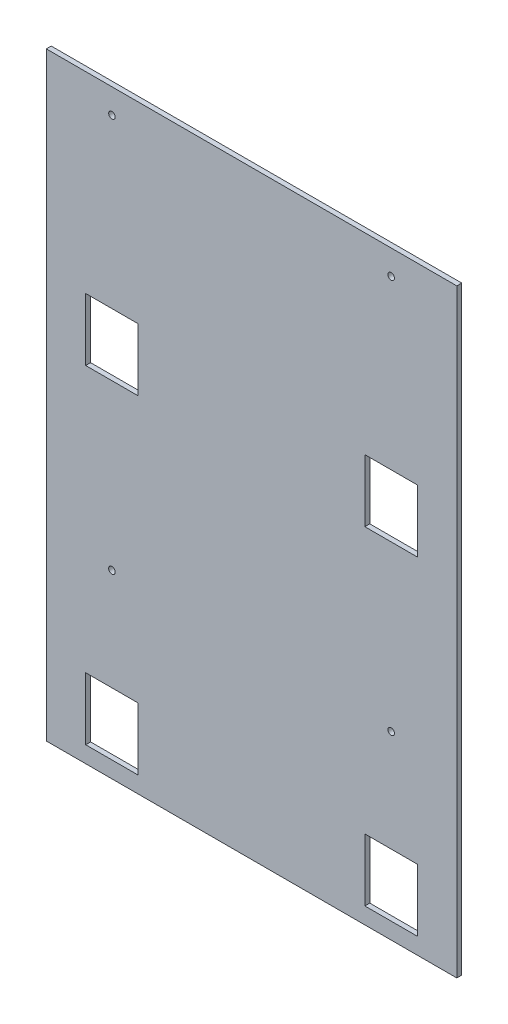
ISO-10303-21;
HEADER;
FILE_DESCRIPTION(('STEP AP214'),'2;1');
FILE_NAME('part.step','',(''),(''),'','','');
FILE_SCHEMA(('AUTOMOTIVE_DESIGN { 1 0 10303 214 1 1 1 1 }'));
ENDSEC;
DATA;
#1=APPLICATION_CONTEXT('core data for automotive mechanical design processes');
#2=APPLICATION_PROTOCOL_DEFINITION('international standard','automotive_design',2000,#1);
#3=PRODUCT_CONTEXT('',#1,'mechanical');
#4=PRODUCT('Part','Part','',(#3));
#5=PRODUCT_RELATED_PRODUCT_CATEGORY('part','',(#4));
#6=PRODUCT_DEFINITION_FORMATION('','',#4);
#7=PRODUCT_DEFINITION_CONTEXT('part definition',#1,'design');
#8=PRODUCT_DEFINITION('design','',#6,#7);
#9=PRODUCT_DEFINITION_SHAPE('','',#8);
#10=(LENGTH_UNIT() NAMED_UNIT(*) SI_UNIT(.MILLI.,.METRE.));
#11=(NAMED_UNIT(*) PLANE_ANGLE_UNIT() SI_UNIT($,.RADIAN.));
#12=(NAMED_UNIT(*) SI_UNIT($,.STERADIAN.) SOLID_ANGLE_UNIT());
#13=UNCERTAINTY_MEASURE_WITH_UNIT(LENGTH_MEASURE(1.E-05),#10,'distance_accuracy_value','');
#14=(GEOMETRIC_REPRESENTATION_CONTEXT(3) GLOBAL_UNCERTAINTY_ASSIGNED_CONTEXT((#13)) GLOBAL_UNIT_ASSIGNED_CONTEXT((#10,
#11,#12)) REPRESENTATION_CONTEXT('',''));
#15=CARTESIAN_POINT('',(0.,0.,0.));
#16=DIRECTION('',(0.,0.,1.));
#17=DIRECTION('',(1.,0.,0.));
#18=AXIS2_PLACEMENT_3D('',#15,#16,#17);
#19=CARTESIAN_POINT('',(-125.,-182.5,3.));
#20=DIRECTION('',(1.,0.,0.));
#21=DIRECTION('',(0.,0.,-1.));
#22=AXIS2_PLACEMENT_3D('',#19,#20,#21);
#23=PLANE('',#22);
#24=DIRECTION('',(0.,-1.,0.));
#25=VECTOR('',#24,1.);
#26=CARTESIAN_POINT('',(-125.,-182.5,0.));
#27=LINE('',#26,#25);
#28=CARTESIAN_POINT('',(-125.,182.5,0.));
#29=VERTEX_POINT('',#28);
#30=CARTESIAN_POINT('',(-125.,-182.5,0.));
#31=VERTEX_POINT('',#30);
#32=EDGE_CURVE('E315',#29,#31,#27,.T.);
#33=ORIENTED_EDGE('',*,*,#32,.T.);
#34=DIRECTION('',(0.,0.,-1.));
#35=VECTOR('',#34,1.);
#36=CARTESIAN_POINT('',(-125.,-182.5,3.));
#37=LINE('',#36,#35);
#38=CARTESIAN_POINT('',(-125.,-182.5,3.));
#39=VERTEX_POINT('',#38);
#40=EDGE_CURVE('E11',#39,#31,#37,.T.);
#41=ORIENTED_EDGE('',*,*,#40,.F.);
#42=DIRECTION('',(0.,-1.,0.));
#43=VECTOR('',#42,1.);
#44=CARTESIAN_POINT('',(-125.,-182.5,3.));
#45=LINE('',#44,#43);
#46=CARTESIAN_POINT('',(-125.,182.5,3.));
#47=VERTEX_POINT('',#46);
#48=EDGE_CURVE('E318',#47,#39,#45,.T.);
#49=ORIENTED_EDGE('',*,*,#48,.F.);
#50=DIRECTION('',(0.,0.,-1.));
#51=VECTOR('',#50,1.);
#52=CARTESIAN_POINT('',(-125.,182.5,3.));
#53=LINE('',#52,#51);
#54=EDGE_CURVE('E328',#47,#29,#53,.T.);
#55=ORIENTED_EDGE('',*,*,#54,.T.);
#56=EDGE_LOOP('',(#33,#41,#49,#55));
#57=FACE_BOUND('',#56,.T.);
#58=ADVANCED_FACE('F34',(#57),#23,.F.);
#59=CARTESIAN_POINT('',(125.,-182.5,3.));
#60=DIRECTION('',(0.,1.,0.));
#61=DIRECTION('',(-1.,0.,0.));
#62=AXIS2_PLACEMENT_3D('',#59,#60,#61);
#63=PLANE('',#62);
#64=DIRECTION('',(1.,0.,0.));
#65=VECTOR('',#64,1.);
#66=CARTESIAN_POINT('',(125.,-182.5,0.));
#67=LINE('',#66,#65);
#68=CARTESIAN_POINT('',(125.,-182.5,0.));
#69=VERTEX_POINT('',#68);
#70=EDGE_CURVE('E331',#31,#69,#67,.T.);
#71=ORIENTED_EDGE('',*,*,#70,.T.);
#72=DIRECTION('',(0.,0.,-1.));
#73=VECTOR('',#72,1.);
#74=CARTESIAN_POINT('',(125.,-182.5,3.));
#75=LINE('',#74,#73);
#76=CARTESIAN_POINT('',(125.,-182.5,3.));
#77=VERTEX_POINT('',#76);
#78=EDGE_CURVE('E41',#77,#69,#75,.T.);
#79=ORIENTED_EDGE('',*,*,#78,.F.);
#80=DIRECTION('',(1.,0.,0.));
#81=VECTOR('',#80,1.);
#82=CARTESIAN_POINT('',(125.,-182.5,3.));
#83=LINE('',#82,#81);
#84=EDGE_CURVE('E321',#39,#77,#83,.T.);
#85=ORIENTED_EDGE('',*,*,#84,.F.);
#86=ORIENTED_EDGE('',*,*,#40,.T.);
#87=EDGE_LOOP('',(#71,#79,#85,#86));
#88=FACE_BOUND('',#87,.T.);
#89=ADVANCED_FACE('F360',(#88),#63,.F.);
#90=CARTESIAN_POINT('',(125.,-182.5,3.));
#91=DIRECTION('',(-1.,0.,0.));
#92=DIRECTION('',(0.,0.,1.));
#93=AXIS2_PLACEMENT_3D('',#90,#91,#92);
#94=PLANE('',#93);
#95=DIRECTION('',(0.,1.,0.));
#96=VECTOR('',#95,1.);
#97=CARTESIAN_POINT('',(125.,-182.5,0.));
#98=LINE('',#97,#96);
#99=CARTESIAN_POINT('',(125.,182.5,0.));
#100=VERTEX_POINT('',#99);
#101=EDGE_CURVE('E333',#69,#100,#98,.T.);
#102=ORIENTED_EDGE('',*,*,#101,.T.);
#103=DIRECTION('',(0.,0.,-1.));
#104=VECTOR('',#103,1.);
#105=CARTESIAN_POINT('',(125.,182.5,3.));
#106=LINE('',#105,#104);
#107=CARTESIAN_POINT('',(125.,182.5,3.));
#108=VERTEX_POINT('',#107);
#109=EDGE_CURVE('E338',#108,#100,#106,.T.);
#110=ORIENTED_EDGE('',*,*,#109,.F.);
#111=DIRECTION('',(0.,1.,0.));
#112=VECTOR('',#111,1.);
#113=CARTESIAN_POINT('',(125.,-182.5,3.));
#114=LINE('',#113,#112);
#115=EDGE_CURVE('E324',#77,#108,#114,.T.);
#116=ORIENTED_EDGE('',*,*,#115,.F.);
#117=ORIENTED_EDGE('',*,*,#78,.T.);
#118=EDGE_LOOP('',(#102,#110,#116,#117));
#119=FACE_BOUND('',#118,.T.);
#120=ADVANCED_FACE('F345',(#119),#94,.F.);
#121=CARTESIAN_POINT('',(125.,182.5,3.));
#122=DIRECTION('',(0.,-1.,0.));
#123=DIRECTION('',(1.,0.,0.));
#124=AXIS2_PLACEMENT_3D('',#121,#122,#123);
#125=PLANE('',#124);
#126=DIRECTION('',(-1.,0.,0.));
#127=VECTOR('',#126,1.);
#128=CARTESIAN_POINT('',(125.,182.5,0.));
#129=LINE('',#128,#127);
#130=EDGE_CURVE('E322',#100,#29,#129,.T.);
#131=ORIENTED_EDGE('',*,*,#130,.T.);
#132=ORIENTED_EDGE('',*,*,#54,.F.);
#133=DIRECTION('',(-1.,0.,0.));
#134=VECTOR('',#133,1.);
#135=CARTESIAN_POINT('',(125.,182.5,3.));
#136=LINE('',#135,#134);
#137=EDGE_CURVE('E326',#108,#47,#136,.T.);
#138=ORIENTED_EDGE('',*,*,#137,.F.);
#139=ORIENTED_EDGE('',*,*,#109,.T.);
#140=EDGE_LOOP('',(#131,#132,#138,#139));
#141=FACE_BOUND('',#140,.T.);
#142=ADVANCED_FACE('F353',(#141),#125,.F.);
#143=CARTESIAN_POINT('',(0.,0.,3.));
#144=DIRECTION('',(0.,0.,1.));
#145=DIRECTION('',(1.,0.,0.));
#146=AXIS2_PLACEMENT_3D('',#143,#144,#145);
#147=PLANE('',#146);
#148=DIRECTION('',(-1.,0.,0.));
#149=VECTOR('',#148,1.);
#150=CARTESIAN_POINT('',(0.,-134.500000000001,3.));
#151=LINE('',#150,#149);
#152=CARTESIAN_POINT('',(-68.9999999999973,-134.500000000001,3.));
#153=VERTEX_POINT('',#152);
#154=CARTESIAN_POINT('',(-100.999999999997,-134.500000000001,3.));
#155=VERTEX_POINT('',#154);
#156=EDGE_CURVE('E291',#153,#155,#151,.T.);
#157=ORIENTED_EDGE('',*,*,#156,.F.);
#158=DIRECTION('',(0.,1.,0.));
#159=VECTOR('',#158,1.);
#160=CARTESIAN_POINT('',(-68.9999999999973,0.,3.));
#161=LINE('',#160,#159);
#162=CARTESIAN_POINT('',(-68.9999999999973,-172.500000000001,3.));
#163=VERTEX_POINT('',#162);
#164=EDGE_CURVE('E285',#163,#153,#161,.T.);
#165=ORIENTED_EDGE('',*,*,#164,.F.);
#166=DIRECTION('',(1.,0.,0.));
#167=VECTOR('',#166,1.);
#168=CARTESIAN_POINT('',(0.,-172.500000000001,3.));
#169=LINE('',#168,#167);
#170=CARTESIAN_POINT('',(-100.999999999997,-172.500000000001,3.));
#171=VERTEX_POINT('',#170);
#172=EDGE_CURVE('E287',#171,#163,#169,.T.);
#173=ORIENTED_EDGE('',*,*,#172,.F.);
#174=DIRECTION('',(0.,-1.,0.));
#175=VECTOR('',#174,1.);
#176=CARTESIAN_POINT('',(-100.999999999997,0.,3.));
#177=LINE('',#176,#175);
#178=EDGE_CURVE('E289',#155,#171,#177,.T.);
#179=ORIENTED_EDGE('',*,*,#178,.F.);
#180=EDGE_LOOP('',(#157,#165,#173,#179));
#181=FACE_BOUND('',#180,.T.);
#182=DIRECTION('',(0.,1.,0.));
#183=VECTOR('',#182,1.);
#184=CARTESIAN_POINT('',(100.999999999997,0.,3.));
#185=LINE('',#184,#183);
#186=CARTESIAN_POINT('',(100.999999999997,27.4999999999986,3.));
#187=VERTEX_POINT('',#186);
#188=CARTESIAN_POINT('',(100.999999999997,65.4999999999986,3.));
#189=VERTEX_POINT('',#188);
#190=EDGE_CURVE('E283',#187,#189,#185,.T.);
#191=ORIENTED_EDGE('',*,*,#190,.F.);
#192=DIRECTION('',(1.,0.,0.));
#193=VECTOR('',#192,1.);
#194=CARTESIAN_POINT('',(0.,27.4999999999986,3.));
#195=LINE('',#194,#193);
#196=CARTESIAN_POINT('',(68.9999999999973,27.4999999999986,3.));
#197=VERTEX_POINT('',#196);
#198=EDGE_CURVE('E277',#197,#187,#195,.T.);
#199=ORIENTED_EDGE('',*,*,#198,.F.);
#200=DIRECTION('',(0.,-1.,0.));
#201=VECTOR('',#200,1.);
#202=CARTESIAN_POINT('',(68.9999999999973,0.,3.));
#203=LINE('',#202,#201);
#204=CARTESIAN_POINT('',(68.9999999999973,65.4999999999986,3.));
#205=VERTEX_POINT('',#204);
#206=EDGE_CURVE('E279',#205,#197,#203,.T.);
#207=ORIENTED_EDGE('',*,*,#206,.F.);
#208=DIRECTION('',(-1.,0.,0.));
#209=VECTOR('',#208,1.);
#210=CARTESIAN_POINT('',(0.,65.4999999999986,3.));
#211=LINE('',#210,#209);
#212=EDGE_CURVE('E281',#189,#205,#211,.T.);
#213=ORIENTED_EDGE('',*,*,#212,.F.);
#214=EDGE_LOOP('',(#191,#199,#207,#213));
#215=FACE_BOUND('',#214,.T.);
#216=DIRECTION('',(-1.,0.,0.));
#217=VECTOR('',#216,1.);
#218=CARTESIAN_POINT('',(0.,65.4999999999986,3.));
#219=LINE('',#218,#217);
#220=CARTESIAN_POINT('',(-68.9999999999973,65.4999999999986,3.));
#221=VERTEX_POINT('',#220);
#222=CARTESIAN_POINT('',(-100.999999999997,65.4999999999986,3.));
#223=VERTEX_POINT('',#222);
#224=EDGE_CURVE('E275',#221,#223,#219,.T.);
#225=ORIENTED_EDGE('',*,*,#224,.F.);
#226=DIRECTION('',(0.,1.,0.));
#227=VECTOR('',#226,1.);
#228=CARTESIAN_POINT('',(-68.9999999999973,0.,3.));
#229=LINE('',#228,#227);
#230=CARTESIAN_POINT('',(-68.9999999999973,27.4999999999986,3.));
#231=VERTEX_POINT('',#230);
#232=EDGE_CURVE('E270',#231,#221,#229,.T.);
#233=ORIENTED_EDGE('',*,*,#232,.F.);
#234=DIRECTION('',(1.,0.,0.));
#235=VECTOR('',#234,1.);
#236=CARTESIAN_POINT('',(0.,27.4999999999986,3.));
#237=LINE('',#236,#235);
#238=CARTESIAN_POINT('',(-100.999999999997,27.4999999999986,3.));
#239=VERTEX_POINT('',#238);
#240=EDGE_CURVE('E178',#239,#231,#237,.T.);
#241=ORIENTED_EDGE('',*,*,#240,.F.);
#242=DIRECTION('',(0.,-1.,0.));
#243=VECTOR('',#242,1.);
#244=CARTESIAN_POINT('',(-100.999999999997,0.,3.));
#245=LINE('',#244,#243);
#246=EDGE_CURVE('E273',#223,#239,#245,.T.);
#247=ORIENTED_EDGE('',*,*,#246,.F.);
#248=EDGE_LOOP('',(#225,#233,#241,#247));
#249=FACE_BOUND('',#248,.T.);
#250=DIRECTION('',(0.,1.,0.));
#251=VECTOR('',#250,1.);
#252=CARTESIAN_POINT('',(100.999999999997,0.,3.));
#253=LINE('',#252,#251);
#254=CARTESIAN_POINT('',(100.999999999997,-172.500000000001,3.));
#255=VERTEX_POINT('',#254);
#256=CARTESIAN_POINT('',(100.999999999997,-134.500000000001,3.));
#257=VERTEX_POINT('',#256);
#258=EDGE_CURVE('E268',#255,#257,#253,.T.);
#259=ORIENTED_EDGE('',*,*,#258,.F.);
#260=DIRECTION('',(1.,0.,0.));
#261=VECTOR('',#260,1.);
#262=CARTESIAN_POINT('',(0.,-172.500000000001,3.));
#263=LINE('',#262,#261);
#264=CARTESIAN_POINT('',(68.9999999999973,-172.500000000001,3.));
#265=VERTEX_POINT('',#264);
#266=EDGE_CURVE('E255',#265,#255,#263,.T.);
#267=ORIENTED_EDGE('',*,*,#266,.F.);
#268=DIRECTION('',(0.,-1.,0.));
#269=VECTOR('',#268,1.);
#270=CARTESIAN_POINT('',(68.9999999999973,0.,3.));
#271=LINE('',#270,#269);
#272=CARTESIAN_POINT('',(68.9999999999973,-134.500000000001,3.));
#273=VERTEX_POINT('',#272);
#274=EDGE_CURVE('E263',#273,#265,#271,.T.);
#275=ORIENTED_EDGE('',*,*,#274,.F.);
#276=DIRECTION('',(-1.,0.,0.));
#277=VECTOR('',#276,1.);
#278=CARTESIAN_POINT('',(0.,-134.500000000001,3.));
#279=LINE('',#278,#277);
#280=EDGE_CURVE('E266',#257,#273,#279,.T.);
#281=ORIENTED_EDGE('',*,*,#280,.F.);
#282=EDGE_LOOP('',(#259,#267,#275,#281));
#283=FACE_BOUND('',#282,.T.);
#284=CARTESIAN_POINT('',(-85.,-72.5,3.));
#285=DIRECTION('',(0.,0.,1.));
#286=DIRECTION('',(1.,0.,0.));
#287=AXIS2_PLACEMENT_3D('',#284,#285,#286);
#288=CIRCLE('',#287,2.);
#289=CARTESIAN_POINT('',(-83.,-72.5,3.));
#290=VERTEX_POINT('',#289);
#291=EDGE_CURVE('E297',#290,#290,#288,.T.);
#292=ORIENTED_EDGE('',*,*,#291,.F.);
#293=EDGE_LOOP('',(#292));
#294=FACE_BOUND('',#293,.T.);
#295=CARTESIAN_POINT('',(85.,-72.5,3.));
#296=DIRECTION('',(0.,0.,1.));
#297=DIRECTION('',(-1.,0.,0.));
#298=AXIS2_PLACEMENT_3D('',#295,#296,#297);
#299=CIRCLE('',#298,2.);
#300=CARTESIAN_POINT('',(83.,-72.5,3.));
#301=VERTEX_POINT('',#300);
#302=EDGE_CURVE('E298',#301,#301,#299,.T.);
#303=ORIENTED_EDGE('',*,*,#302,.F.);
#304=EDGE_LOOP('',(#303));
#305=FACE_BOUND('',#304,.T.);
#306=CARTESIAN_POINT('',(85.,167.5,3.));
#307=DIRECTION('',(0.,0.,1.));
#308=DIRECTION('',(-1.,0.,0.));
#309=AXIS2_PLACEMENT_3D('',#306,#307,#308);
#310=CIRCLE('',#309,2.);
#311=CARTESIAN_POINT('',(83.,167.5,3.));
#312=VERTEX_POINT('',#311);
#313=EDGE_CURVE('E293',#312,#312,#310,.T.);
#314=ORIENTED_EDGE('',*,*,#313,.F.);
#315=EDGE_LOOP('',(#314));
#316=FACE_BOUND('',#315,.T.);
#317=CARTESIAN_POINT('',(-85.,167.5,3.));
#318=DIRECTION('',(0.,0.,1.));
#319=DIRECTION('',(1.,0.,0.));
#320=AXIS2_PLACEMENT_3D('',#317,#318,#319);
#321=CIRCLE('',#320,2.);
#322=CARTESIAN_POINT('',(-83.,167.5,3.));
#323=VERTEX_POINT('',#322);
#324=EDGE_CURVE('E309',#323,#323,#321,.T.);
#325=ORIENTED_EDGE('',*,*,#324,.F.);
#326=EDGE_LOOP('',(#325));
#327=FACE_BOUND('',#326,.T.);
#328=ORIENTED_EDGE('',*,*,#48,.T.);
#329=ORIENTED_EDGE('',*,*,#84,.T.);
#330=ORIENTED_EDGE('',*,*,#115,.T.);
#331=ORIENTED_EDGE('',*,*,#137,.T.);
#332=EDGE_LOOP('',(#328,#329,#330,#331));
#333=FACE_BOUND('',#332,.T.);
#334=ADVANCED_FACE('F359',(#181,#215,#249,#283,#294,#305,#316,#327,#333),#147,.T.);
#335=CARTESIAN_POINT('',(0.,0.,0.));
#336=DIRECTION('',(0.,0.,1.));
#337=DIRECTION('',(1.,0.,0.));
#338=AXIS2_PLACEMENT_3D('',#335,#336,#337);
#339=PLANE('',#338);
#340=DIRECTION('',(0.,-1.,0.));
#341=VECTOR('',#340,1.);
#342=CARTESIAN_POINT('',(-68.9999999999973,-134.500000000001,0.));
#343=LINE('',#342,#341);
#344=CARTESIAN_POINT('',(-68.9999999999973,-134.500000000001,0.));
#345=VERTEX_POINT('',#344);
#346=CARTESIAN_POINT('',(-68.9999999999973,-172.500000000001,0.));
#347=VERTEX_POINT('',#346);
#348=EDGE_CURVE('E208',#345,#347,#343,.T.);
#349=ORIENTED_EDGE('',*,*,#348,.F.);
#350=DIRECTION('',(1.,0.,0.));
#351=VECTOR('',#350,1.);
#352=CARTESIAN_POINT('',(-100.999999999997,-134.500000000001,0.));
#353=LINE('',#352,#351);
#354=CARTESIAN_POINT('',(-100.999999999997,-134.500000000001,0.));
#355=VERTEX_POINT('',#354);
#356=EDGE_CURVE('E206',#355,#345,#353,.T.);
#357=ORIENTED_EDGE('',*,*,#356,.F.);
#358=DIRECTION('',(0.,1.,0.));
#359=VECTOR('',#358,1.);
#360=CARTESIAN_POINT('',(-100.999999999997,-134.500000000001,0.));
#361=LINE('',#360,#359);
#362=CARTESIAN_POINT('',(-100.999999999997,-172.500000000001,0.));
#363=VERTEX_POINT('',#362);
#364=EDGE_CURVE('E214',#363,#355,#361,.T.);
#365=ORIENTED_EDGE('',*,*,#364,.F.);
#366=DIRECTION('',(-1.,0.,0.));
#367=VECTOR('',#366,1.);
#368=CARTESIAN_POINT('',(-100.999999999997,-172.500000000001,0.));
#369=LINE('',#368,#367);
#370=EDGE_CURVE('E211',#347,#363,#369,.T.);
#371=ORIENTED_EDGE('',*,*,#370,.F.);
#372=EDGE_LOOP('',(#349,#357,#365,#371));
#373=FACE_BOUND('',#372,.T.);
#374=DIRECTION('',(-1.,0.,0.));
#375=VECTOR('',#374,1.);
#376=CARTESIAN_POINT('',(100.999999999997,27.4999999999986,0.));
#377=LINE('',#376,#375);
#378=CARTESIAN_POINT('',(100.999999999997,27.4999999999986,0.));
#379=VERTEX_POINT('',#378);
#380=CARTESIAN_POINT('',(68.9999999999973,27.4999999999986,0.));
#381=VERTEX_POINT('',#380);
#382=EDGE_CURVE('E227',#379,#381,#377,.T.);
#383=ORIENTED_EDGE('',*,*,#382,.F.);
#384=DIRECTION('',(0.,-1.,0.));
#385=VECTOR('',#384,1.);
#386=CARTESIAN_POINT('',(100.999999999997,65.4999999999986,0.));
#387=LINE('',#386,#385);
#388=CARTESIAN_POINT('',(100.999999999997,65.4999999999986,0.));
#389=VERTEX_POINT('',#388);
#390=EDGE_CURVE('E203',#389,#379,#387,.T.);
#391=ORIENTED_EDGE('',*,*,#390,.F.);
#392=DIRECTION('',(1.,0.,0.));
#393=VECTOR('',#392,1.);
#394=CARTESIAN_POINT('',(100.999999999997,65.4999999999986,0.));
#395=LINE('',#394,#393);
#396=CARTESIAN_POINT('',(68.9999999999973,65.4999999999986,0.));
#397=VERTEX_POINT('',#396);
#398=EDGE_CURVE('E232',#397,#389,#395,.T.);
#399=ORIENTED_EDGE('',*,*,#398,.F.);
#400=DIRECTION('',(0.,1.,0.));
#401=VECTOR('',#400,1.);
#402=CARTESIAN_POINT('',(68.9999999999973,65.4999999999986,0.));
#403=LINE('',#402,#401);
#404=EDGE_CURVE('E229',#381,#397,#403,.T.);
#405=ORIENTED_EDGE('',*,*,#404,.F.);
#406=EDGE_LOOP('',(#383,#391,#399,#405));
#407=FACE_BOUND('',#406,.T.);
#408=DIRECTION('',(0.,-1.,0.));
#409=VECTOR('',#408,1.);
#410=CARTESIAN_POINT('',(-68.9999999999973,65.4999999999986,0.));
#411=LINE('',#410,#409);
#412=CARTESIAN_POINT('',(-68.9999999999973,65.4999999999986,0.));
#413=VERTEX_POINT('',#412);
#414=CARTESIAN_POINT('',(-68.9999999999973,27.4999999999986,0.));
#415=VERTEX_POINT('',#414);
#416=EDGE_CURVE('E186',#413,#415,#411,.T.);
#417=ORIENTED_EDGE('',*,*,#416,.F.);
#418=DIRECTION('',(1.,0.,0.));
#419=VECTOR('',#418,1.);
#420=CARTESIAN_POINT('',(-100.999999999997,65.4999999999986,0.));
#421=LINE('',#420,#419);
#422=CARTESIAN_POINT('',(-100.999999999997,65.4999999999986,0.));
#423=VERTEX_POINT('',#422);
#424=EDGE_CURVE('E191',#423,#413,#421,.T.);
#425=ORIENTED_EDGE('',*,*,#424,.F.);
#426=DIRECTION('',(0.,1.,0.));
#427=VECTOR('',#426,1.);
#428=CARTESIAN_POINT('',(-100.999999999997,65.4999999999986,0.));
#429=LINE('',#428,#427);
#430=CARTESIAN_POINT('',(-100.999999999997,27.4999999999986,0.));
#431=VERTEX_POINT('',#430);
#432=EDGE_CURVE('E196',#431,#423,#429,.T.);
#433=ORIENTED_EDGE('',*,*,#432,.F.);
#434=DIRECTION('',(-1.,0.,0.));
#435=VECTOR('',#434,1.);
#436=CARTESIAN_POINT('',(-100.999999999997,27.4999999999986,0.));
#437=LINE('',#436,#435);
#438=EDGE_CURVE('E175',#415,#431,#437,.T.);
#439=ORIENTED_EDGE('',*,*,#438,.F.);
#440=EDGE_LOOP('',(#417,#425,#433,#439));
#441=FACE_BOUND('',#440,.T.);
#442=DIRECTION('',(-1.,0.,0.));
#443=VECTOR('',#442,1.);
#444=CARTESIAN_POINT('',(100.999999999997,-172.500000000001,0.));
#445=LINE('',#444,#443);
#446=CARTESIAN_POINT('',(100.999999999997,-172.500000000001,0.));
#447=VERTEX_POINT('',#446);
#448=CARTESIAN_POINT('',(68.9999999999973,-172.500000000001,0.));
#449=VERTEX_POINT('',#448);
#450=EDGE_CURVE('E243',#447,#449,#445,.T.);
#451=ORIENTED_EDGE('',*,*,#450,.F.);
#452=DIRECTION('',(0.,-1.,0.));
#453=VECTOR('',#452,1.);
#454=CARTESIAN_POINT('',(100.999999999997,-134.500000000001,0.));
#455=LINE('',#454,#453);
#456=CARTESIAN_POINT('',(100.999999999997,-134.500000000001,0.));
#457=VERTEX_POINT('',#456);
#458=EDGE_CURVE('E220',#457,#447,#455,.T.);
#459=ORIENTED_EDGE('',*,*,#458,.F.);
#460=DIRECTION('',(1.,0.,0.));
#461=VECTOR('',#460,1.);
#462=CARTESIAN_POINT('',(100.999999999997,-134.500000000001,0.));
#463=LINE('',#462,#461);
#464=CARTESIAN_POINT('',(68.9999999999973,-134.500000000001,0.));
#465=VERTEX_POINT('',#464);
#466=EDGE_CURVE('E249',#465,#457,#463,.T.);
#467=ORIENTED_EDGE('',*,*,#466,.F.);
#468=DIRECTION('',(0.,1.,0.));
#469=VECTOR('',#468,1.);
#470=CARTESIAN_POINT('',(68.9999999999973,-134.500000000001,0.));
#471=LINE('',#470,#469);
#472=EDGE_CURVE('E246',#449,#465,#471,.T.);
#473=ORIENTED_EDGE('',*,*,#472,.F.);
#474=EDGE_LOOP('',(#451,#459,#467,#473));
#475=FACE_BOUND('',#474,.T.);
#476=CARTESIAN_POINT('',(-85.,-72.5,0.));
#477=DIRECTION('',(0.,0.,1.));
#478=DIRECTION('',(1.,0.,0.));
#479=AXIS2_PLACEMENT_3D('',#476,#477,#478);
#480=CIRCLE('',#479,2.);
#481=CARTESIAN_POINT('',(-83.,-72.5,0.));
#482=VERTEX_POINT('',#481);
#483=EDGE_CURVE('E306',#482,#482,#480,.T.);
#484=ORIENTED_EDGE('',*,*,#483,.T.);
#485=EDGE_LOOP('',(#484));
#486=FACE_BOUND('',#485,.T.);
#487=CARTESIAN_POINT('',(85.,-72.5,0.));
#488=DIRECTION('',(0.,0.,1.));
#489=DIRECTION('',(-1.,0.,0.));
#490=AXIS2_PLACEMENT_3D('',#487,#488,#489);
#491=CIRCLE('',#490,2.);
#492=CARTESIAN_POINT('',(83.,-72.5,0.));
#493=VERTEX_POINT('',#492);
#494=EDGE_CURVE('E294',#493,#493,#491,.T.);
#495=ORIENTED_EDGE('',*,*,#494,.T.);
#496=EDGE_LOOP('',(#495));
#497=FACE_BOUND('',#496,.T.);
#498=CARTESIAN_POINT('',(85.,167.5,0.));
#499=DIRECTION('',(0.,0.,1.));
#500=DIRECTION('',(-1.,0.,0.));
#501=AXIS2_PLACEMENT_3D('',#498,#499,#500);
#502=CIRCLE('',#501,2.);
#503=CARTESIAN_POINT('',(83.,167.5,0.));
#504=VERTEX_POINT('',#503);
#505=EDGE_CURVE('E301',#504,#504,#502,.T.);
#506=ORIENTED_EDGE('',*,*,#505,.T.);
#507=EDGE_LOOP('',(#506));
#508=FACE_BOUND('',#507,.T.);
#509=CARTESIAN_POINT('',(-85.,167.5,0.));
#510=DIRECTION('',(0.,0.,1.));
#511=DIRECTION('',(1.,0.,0.));
#512=AXIS2_PLACEMENT_3D('',#509,#510,#511);
#513=CIRCLE('',#512,2.);
#514=CARTESIAN_POINT('',(-83.,167.5,0.));
#515=VERTEX_POINT('',#514);
#516=EDGE_CURVE('E312',#515,#515,#513,.T.);
#517=ORIENTED_EDGE('',*,*,#516,.T.);
#518=EDGE_LOOP('',(#517));
#519=FACE_BOUND('',#518,.T.);
#520=ORIENTED_EDGE('',*,*,#32,.F.);
#521=ORIENTED_EDGE('',*,*,#130,.F.);
#522=ORIENTED_EDGE('',*,*,#101,.F.);
#523=ORIENTED_EDGE('',*,*,#70,.F.);
#524=EDGE_LOOP('',(#520,#521,#522,#523));
#525=FACE_BOUND('',#524,.T.);
#526=ADVANCED_FACE('F193',(#373,#407,#441,#475,#486,#497,#508,#519,#525),#339,.F.);
#527=CARTESIAN_POINT('',(-85.,167.5,0.));
#528=DIRECTION('',(0.,0.,1.));
#529=DIRECTION('',(1.,0.,0.));
#530=AXIS2_PLACEMENT_3D('',#527,#528,#529);
#531=CYLINDRICAL_SURFACE('',#530,2.);
#532=ORIENTED_EDGE('',*,*,#516,.F.);
#533=EDGE_LOOP('',(#532));
#534=FACE_BOUND('',#533,.T.);
#535=ORIENTED_EDGE('',*,*,#324,.T.);
#536=EDGE_LOOP('',(#535));
#537=FACE_BOUND('',#536,.T.);
#538=ADVANCED_FACE('F372',(#534,#537),#531,.F.);
#539=CARTESIAN_POINT('',(85.,167.5,0.));
#540=DIRECTION('',(0.,0.,1.));
#541=DIRECTION('',(1.,0.,0.));
#542=AXIS2_PLACEMENT_3D('',#539,#540,#541);
#543=CYLINDRICAL_SURFACE('',#542,2.);
#544=ORIENTED_EDGE('',*,*,#505,.F.);
#545=EDGE_LOOP('',(#544));
#546=FACE_BOUND('',#545,.T.);
#547=ORIENTED_EDGE('',*,*,#313,.T.);
#548=EDGE_LOOP('',(#547));
#549=FACE_BOUND('',#548,.T.);
#550=ADVANCED_FACE('F379',(#546,#549),#543,.F.);
#551=CARTESIAN_POINT('',(85.,-72.5,0.));
#552=DIRECTION('',(0.,0.,1.));
#553=DIRECTION('',(1.,0.,0.));
#554=AXIS2_PLACEMENT_3D('',#551,#552,#553);
#555=CYLINDRICAL_SURFACE('',#554,2.);
#556=ORIENTED_EDGE('',*,*,#494,.F.);
#557=EDGE_LOOP('',(#556));
#558=FACE_BOUND('',#557,.T.);
#559=ORIENTED_EDGE('',*,*,#302,.T.);
#560=EDGE_LOOP('',(#559));
#561=FACE_BOUND('',#560,.T.);
#562=ADVANCED_FACE('F385',(#558,#561),#555,.F.);
#563=CARTESIAN_POINT('',(-85.,-72.5,0.));
#564=DIRECTION('',(0.,0.,1.));
#565=DIRECTION('',(1.,0.,0.));
#566=AXIS2_PLACEMENT_3D('',#563,#564,#565);
#567=CYLINDRICAL_SURFACE('',#566,2.);
#568=ORIENTED_EDGE('',*,*,#483,.F.);
#569=EDGE_LOOP('',(#568));
#570=FACE_BOUND('',#569,.T.);
#571=ORIENTED_EDGE('',*,*,#291,.T.);
#572=EDGE_LOOP('',(#571));
#573=FACE_BOUND('',#572,.T.);
#574=ADVANCED_FACE('F381',(#570,#573),#567,.F.);
#575=CARTESIAN_POINT('',(100.999999999997,-134.500000000001,10.));
#576=DIRECTION('',(1.,0.,0.));
#577=DIRECTION('',(0.,0.,-1.));
#578=AXIS2_PLACEMENT_3D('',#575,#576,#577);
#579=PLANE('',#578);
#580=ORIENTED_EDGE('',*,*,#258,.T.);
#581=DIRECTION('',(0.,0.,-1.));
#582=VECTOR('',#581,1.);
#583=CARTESIAN_POINT('',(100.999999999997,-134.500000000001,10.));
#584=LINE('',#583,#582);
#585=EDGE_CURVE('E253',#257,#457,#584,.T.);
#586=ORIENTED_EDGE('',*,*,#585,.T.);
#587=ORIENTED_EDGE('',*,*,#458,.T.);
#588=DIRECTION('',(0.,0.,-1.));
#589=VECTOR('',#588,1.);
#590=CARTESIAN_POINT('',(100.999999999997,-172.500000000001,10.));
#591=LINE('',#590,#589);
#592=EDGE_CURVE('E252',#255,#447,#591,.T.);
#593=ORIENTED_EDGE('',*,*,#592,.F.);
#594=EDGE_LOOP('',(#580,#586,#587,#593));
#595=FACE_BOUND('',#594,.T.);
#596=ADVANCED_FACE('F384',(#595),#579,.F.);
#597=CARTESIAN_POINT('',(100.999999999997,-134.500000000001,10.));
#598=DIRECTION('',(0.,1.,0.));
#599=DIRECTION('',(0.,0.,1.));
#600=AXIS2_PLACEMENT_3D('',#597,#598,#599);
#601=PLANE('',#600);
#602=ORIENTED_EDGE('',*,*,#280,.T.);
#603=DIRECTION('',(0.,0.,-1.));
#604=VECTOR('',#603,1.);
#605=CARTESIAN_POINT('',(68.9999999999973,-134.500000000001,10.));
#606=LINE('',#605,#604);
#607=EDGE_CURVE('E256',#273,#465,#606,.T.);
#608=ORIENTED_EDGE('',*,*,#607,.T.);
#609=ORIENTED_EDGE('',*,*,#466,.T.);
#610=ORIENTED_EDGE('',*,*,#585,.F.);
#611=EDGE_LOOP('',(#602,#608,#609,#610));
#612=FACE_BOUND('',#611,.T.);
#613=ADVANCED_FACE('F395',(#612),#601,.F.);
#614=CARTESIAN_POINT('',(68.9999999999973,-134.500000000001,10.));
#615=DIRECTION('',(-1.,0.,0.));
#616=DIRECTION('',(0.,0.,1.));
#617=AXIS2_PLACEMENT_3D('',#614,#615,#616);
#618=PLANE('',#617);
#619=ORIENTED_EDGE('',*,*,#274,.T.);
#620=DIRECTION('',(0.,0.,-1.));
#621=VECTOR('',#620,1.);
#622=CARTESIAN_POINT('',(68.9999999999973,-172.500000000001,10.));
#623=LINE('',#622,#621);
#624=EDGE_CURVE('E258',#265,#449,#623,.T.);
#625=ORIENTED_EDGE('',*,*,#624,.T.);
#626=ORIENTED_EDGE('',*,*,#472,.T.);
#627=ORIENTED_EDGE('',*,*,#607,.F.);
#628=EDGE_LOOP('',(#619,#625,#626,#627));
#629=FACE_BOUND('',#628,.T.);
#630=ADVANCED_FACE('F401',(#629),#618,.F.);
#631=CARTESIAN_POINT('',(100.999999999997,-172.500000000001,10.));
#632=DIRECTION('',(0.,-1.,0.));
#633=DIRECTION('',(0.,0.,-1.));
#634=AXIS2_PLACEMENT_3D('',#631,#632,#633);
#635=PLANE('',#634);
#636=ORIENTED_EDGE('',*,*,#266,.T.);
#637=ORIENTED_EDGE('',*,*,#592,.T.);
#638=ORIENTED_EDGE('',*,*,#450,.T.);
#639=ORIENTED_EDGE('',*,*,#624,.F.);
#640=EDGE_LOOP('',(#636,#637,#638,#639));
#641=FACE_BOUND('',#640,.T.);
#642=ADVANCED_FACE('F397',(#641),#635,.F.);
#643=CARTESIAN_POINT('',(-100.999999999997,65.4999999999986,10.));
#644=DIRECTION('',(0.,1.,0.));
#645=DIRECTION('',(0.,0.,1.));
#646=AXIS2_PLACEMENT_3D('',#643,#644,#645);
#647=PLANE('',#646);
#648=ORIENTED_EDGE('',*,*,#224,.T.);
#649=DIRECTION('',(0.,0.,-1.));
#650=VECTOR('',#649,1.);
#651=CARTESIAN_POINT('',(-100.999999999997,65.4999999999986,10.));
#652=LINE('',#651,#650);
#653=EDGE_CURVE('E201',#223,#423,#652,.T.);
#654=ORIENTED_EDGE('',*,*,#653,.T.);
#655=ORIENTED_EDGE('',*,*,#424,.T.);
#656=DIRECTION('',(0.,0.,-1.));
#657=VECTOR('',#656,1.);
#658=CARTESIAN_POINT('',(-68.9999999999973,65.4999999999986,10.));
#659=LINE('',#658,#657);
#660=EDGE_CURVE('E182',#221,#413,#659,.T.);
#661=ORIENTED_EDGE('',*,*,#660,.F.);
#662=EDGE_LOOP('',(#648,#654,#655,#661));
#663=FACE_BOUND('',#662,.T.);
#664=ADVANCED_FACE('F400',(#663),#647,.F.);
#665=CARTESIAN_POINT('',(-100.999999999997,65.4999999999986,10.));
#666=DIRECTION('',(-1.,0.,0.));
#667=DIRECTION('',(0.,0.,1.));
#668=AXIS2_PLACEMENT_3D('',#665,#666,#667);
#669=PLANE('',#668);
#670=ORIENTED_EDGE('',*,*,#246,.T.);
#671=DIRECTION('',(0.,0.,-1.));
#672=VECTOR('',#671,1.);
#673=CARTESIAN_POINT('',(-100.999999999997,27.4999999999986,10.));
#674=LINE('',#673,#672);
#675=EDGE_CURVE('E181',#239,#431,#674,.T.);
#676=ORIENTED_EDGE('',*,*,#675,.T.);
#677=ORIENTED_EDGE('',*,*,#432,.T.);
#678=ORIENTED_EDGE('',*,*,#653,.F.);
#679=EDGE_LOOP('',(#670,#676,#677,#678));
#680=FACE_BOUND('',#679,.T.);
#681=ADVANCED_FACE('F441',(#680),#669,.F.);
#682=CARTESIAN_POINT('',(-100.999999999997,27.4999999999986,10.));
#683=DIRECTION('',(0.,-1.,0.));
#684=DIRECTION('',(0.,0.,-1.));
#685=AXIS2_PLACEMENT_3D('',#682,#683,#684);
#686=PLANE('',#685);
#687=ORIENTED_EDGE('',*,*,#240,.T.);
#688=DIRECTION('',(0.,0.,-1.));
#689=VECTOR('',#688,1.);
#690=CARTESIAN_POINT('',(-68.9999999999973,27.4999999999986,10.));
#691=LINE('',#690,#689);
#692=EDGE_CURVE('E170',#231,#415,#691,.T.);
#693=ORIENTED_EDGE('',*,*,#692,.T.);
#694=ORIENTED_EDGE('',*,*,#438,.T.);
#695=ORIENTED_EDGE('',*,*,#675,.F.);
#696=EDGE_LOOP('',(#687,#693,#694,#695));
#697=FACE_BOUND('',#696,.T.);
#698=ADVANCED_FACE('F172',(#697),#686,.F.);
#699=CARTESIAN_POINT('',(-68.9999999999973,65.4999999999986,10.));
#700=DIRECTION('',(1.,0.,0.));
#701=DIRECTION('',(0.,0.,-1.));
#702=AXIS2_PLACEMENT_3D('',#699,#700,#701);
#703=PLANE('',#702);
#704=ORIENTED_EDGE('',*,*,#232,.T.);
#705=ORIENTED_EDGE('',*,*,#660,.T.);
#706=ORIENTED_EDGE('',*,*,#416,.T.);
#707=ORIENTED_EDGE('',*,*,#692,.F.);
#708=EDGE_LOOP('',(#704,#705,#706,#707));
#709=FACE_BOUND('',#708,.T.);
#710=ADVANCED_FACE('F187',(#709),#703,.F.);
#711=CARTESIAN_POINT('',(100.999999999997,65.4999999999986,10.));
#712=DIRECTION('',(1.,0.,0.));
#713=DIRECTION('',(0.,0.,-1.));
#714=AXIS2_PLACEMENT_3D('',#711,#712,#713);
#715=PLANE('',#714);
#716=ORIENTED_EDGE('',*,*,#190,.T.);
#717=DIRECTION('',(0.,0.,-1.));
#718=VECTOR('',#717,1.);
#719=CARTESIAN_POINT('',(100.999999999997,65.4999999999986,10.));
#720=LINE('',#719,#718);
#721=EDGE_CURVE('E209',#189,#389,#720,.T.);
#722=ORIENTED_EDGE('',*,*,#721,.T.);
#723=ORIENTED_EDGE('',*,*,#390,.T.);
#724=DIRECTION('',(0.,0.,-1.));
#725=VECTOR('',#724,1.);
#726=CARTESIAN_POINT('',(100.999999999997,27.4999999999986,10.));
#727=LINE('',#726,#725);
#728=EDGE_CURVE('E235',#187,#379,#727,.T.);
#729=ORIENTED_EDGE('',*,*,#728,.F.);
#730=EDGE_LOOP('',(#716,#722,#723,#729));
#731=FACE_BOUND('',#730,.T.);
#732=ADVANCED_FACE('F409',(#731),#715,.F.);
#733=CARTESIAN_POINT('',(100.999999999997,65.4999999999986,10.));
#734=DIRECTION('',(0.,1.,0.));
#735=DIRECTION('',(0.,0.,1.));
#736=AXIS2_PLACEMENT_3D('',#733,#734,#735);
#737=PLANE('',#736);
#738=ORIENTED_EDGE('',*,*,#212,.T.);
#739=DIRECTION('',(0.,0.,-1.));
#740=VECTOR('',#739,1.);
#741=CARTESIAN_POINT('',(68.9999999999973,65.4999999999986,10.));
#742=LINE('',#741,#740);
#743=EDGE_CURVE('E237',#205,#397,#742,.T.);
#744=ORIENTED_EDGE('',*,*,#743,.T.);
#745=ORIENTED_EDGE('',*,*,#398,.T.);
#746=ORIENTED_EDGE('',*,*,#721,.F.);
#747=EDGE_LOOP('',(#738,#744,#745,#746));
#748=FACE_BOUND('',#747,.T.);
#749=ADVANCED_FACE('F412',(#748),#737,.F.);
#750=CARTESIAN_POINT('',(68.9999999999973,65.4999999999986,10.));
#751=DIRECTION('',(-1.,0.,0.));
#752=DIRECTION('',(0.,0.,1.));
#753=AXIS2_PLACEMENT_3D('',#750,#751,#752);
#754=PLANE('',#753);
#755=ORIENTED_EDGE('',*,*,#206,.T.);
#756=DIRECTION('',(0.,0.,-1.));
#757=VECTOR('',#756,1.);
#758=CARTESIAN_POINT('',(68.9999999999973,27.4999999999986,10.));
#759=LINE('',#758,#757);
#760=EDGE_CURVE('E56',#197,#381,#759,.T.);
#761=ORIENTED_EDGE('',*,*,#760,.T.);
#762=ORIENTED_EDGE('',*,*,#404,.T.);
#763=ORIENTED_EDGE('',*,*,#743,.F.);
#764=EDGE_LOOP('',(#755,#761,#762,#763));
#765=FACE_BOUND('',#764,.T.);
#766=ADVANCED_FACE('F418',(#765),#754,.F.);
#767=CARTESIAN_POINT('',(100.999999999997,27.4999999999986,10.));
#768=DIRECTION('',(0.,-1.,0.));
#769=DIRECTION('',(0.,0.,-1.));
#770=AXIS2_PLACEMENT_3D('',#767,#768,#769);
#771=PLANE('',#770);
#772=ORIENTED_EDGE('',*,*,#198,.T.);
#773=ORIENTED_EDGE('',*,*,#728,.T.);
#774=ORIENTED_EDGE('',*,*,#382,.T.);
#775=ORIENTED_EDGE('',*,*,#760,.F.);
#776=EDGE_LOOP('',(#772,#773,#774,#775));
#777=FACE_BOUND('',#776,.T.);
#778=ADVANCED_FACE('F414',(#777),#771,.F.);
#779=CARTESIAN_POINT('',(-100.999999999997,-134.500000000001,10.));
#780=DIRECTION('',(0.,1.,0.));
#781=DIRECTION('',(0.,0.,1.));
#782=AXIS2_PLACEMENT_3D('',#779,#780,#781);
#783=PLANE('',#782);
#784=ORIENTED_EDGE('',*,*,#156,.T.);
#785=DIRECTION('',(0.,0.,-1.));
#786=VECTOR('',#785,1.);
#787=CARTESIAN_POINT('',(-100.999999999997,-134.500000000001,10.));
#788=LINE('',#787,#786);
#789=EDGE_CURVE('E218',#155,#355,#788,.T.);
#790=ORIENTED_EDGE('',*,*,#789,.T.);
#791=ORIENTED_EDGE('',*,*,#356,.T.);
#792=DIRECTION('',(0.,0.,-1.));
#793=VECTOR('',#792,1.);
#794=CARTESIAN_POINT('',(-68.9999999999973,-134.500000000001,10.));
#795=LINE('',#794,#793);
#796=EDGE_CURVE('E217',#153,#345,#795,.T.);
#797=ORIENTED_EDGE('',*,*,#796,.F.);
#798=EDGE_LOOP('',(#784,#790,#791,#797));
#799=FACE_BOUND('',#798,.T.);
#800=ADVANCED_FACE('F417',(#799),#783,.F.);
#801=CARTESIAN_POINT('',(-100.999999999997,-134.500000000001,10.));
#802=DIRECTION('',(-1.,0.,0.));
#803=DIRECTION('',(0.,0.,1.));
#804=AXIS2_PLACEMENT_3D('',#801,#802,#803);
#805=PLANE('',#804);
#806=ORIENTED_EDGE('',*,*,#178,.T.);
#807=DIRECTION('',(0.,0.,-1.));
#808=VECTOR('',#807,1.);
#809=CARTESIAN_POINT('',(-100.999999999997,-172.500000000001,10.));
#810=LINE('',#809,#808);
#811=EDGE_CURVE('E221',#171,#363,#810,.T.);
#812=ORIENTED_EDGE('',*,*,#811,.T.);
#813=ORIENTED_EDGE('',*,*,#364,.T.);
#814=ORIENTED_EDGE('',*,*,#789,.F.);
#815=EDGE_LOOP('',(#806,#812,#813,#814));
#816=FACE_BOUND('',#815,.T.);
#817=ADVANCED_FACE('F427',(#816),#805,.F.);
#818=CARTESIAN_POINT('',(-100.999999999997,-172.500000000001,10.));
#819=DIRECTION('',(0.,-1.,0.));
#820=DIRECTION('',(0.,0.,-1.));
#821=AXIS2_PLACEMENT_3D('',#818,#819,#820);
#822=PLANE('',#821);
#823=ORIENTED_EDGE('',*,*,#172,.T.);
#824=DIRECTION('',(0.,0.,-1.));
#825=VECTOR('',#824,1.);
#826=CARTESIAN_POINT('',(-68.9999999999973,-172.500000000001,10.));
#827=LINE('',#826,#825);
#828=EDGE_CURVE('E48',#163,#347,#827,.T.);
#829=ORIENTED_EDGE('',*,*,#828,.T.);
#830=ORIENTED_EDGE('',*,*,#370,.T.);
#831=ORIENTED_EDGE('',*,*,#811,.F.);
#832=EDGE_LOOP('',(#823,#829,#830,#831));
#833=FACE_BOUND('',#832,.T.);
#834=ADVANCED_FACE('F432',(#833),#822,.F.);
#835=CARTESIAN_POINT('',(-68.9999999999973,-134.500000000001,10.));
#836=DIRECTION('',(1.,0.,0.));
#837=DIRECTION('',(0.,0.,-1.));
#838=AXIS2_PLACEMENT_3D('',#835,#836,#837);
#839=PLANE('',#838);
#840=ORIENTED_EDGE('',*,*,#164,.T.);
#841=ORIENTED_EDGE('',*,*,#796,.T.);
#842=ORIENTED_EDGE('',*,*,#348,.T.);
#843=ORIENTED_EDGE('',*,*,#828,.F.);
#844=EDGE_LOOP('',(#840,#841,#842,#843));
#845=FACE_BOUND('',#844,.T.);
#846=ADVANCED_FACE('F429',(#845),#839,.F.);
#847=CLOSED_SHELL('',(#58,#89,#120,#142,#334,#526,#538,#550,#562,#574,#596,#613,#630,#642,#664,
#681,#698,#710,#732,#749,#766,#778,#800,#817,#834,#846));
#848=MANIFOLD_SOLID_BREP('B2',#847);
#849=ADVANCED_BREP_SHAPE_REPRESENTATION('',(#18,#848),#14);
#850=SHAPE_DEFINITION_REPRESENTATION(#9,#849);
ENDSEC;
END-ISO-10303-21;
